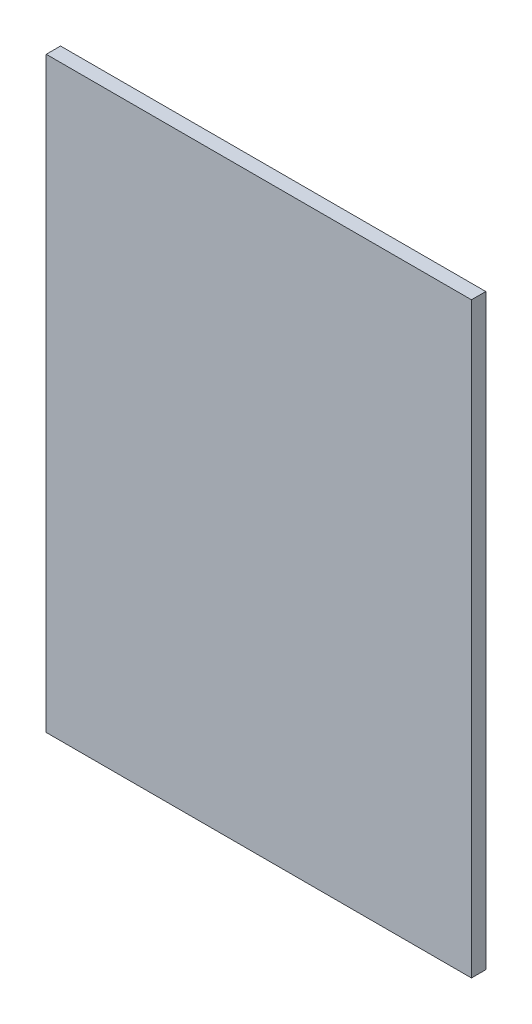
ISO-10303-21;
HEADER;
FILE_DESCRIPTION(('STEP AP214'),'2;1');
FILE_NAME('part.step','',(''),(''),'','','');
FILE_SCHEMA(('AUTOMOTIVE_DESIGN { 1 0 10303 214 1 1 1 1 }'));
ENDSEC;
DATA;
#1=APPLICATION_CONTEXT('core data for automotive mechanical design processes');
#2=APPLICATION_PROTOCOL_DEFINITION('international standard','automotive_design',2000,#1);
#3=PRODUCT_CONTEXT('',#1,'mechanical');
#4=PRODUCT('Part','Part','',(#3));
#5=PRODUCT_RELATED_PRODUCT_CATEGORY('part','',(#4));
#6=PRODUCT_DEFINITION_FORMATION('','',#4);
#7=PRODUCT_DEFINITION_CONTEXT('part definition',#1,'design');
#8=PRODUCT_DEFINITION('design','',#6,#7);
#9=PRODUCT_DEFINITION_SHAPE('','',#8);
#10=(LENGTH_UNIT() NAMED_UNIT(*) SI_UNIT(.MILLI.,.METRE.));
#11=(NAMED_UNIT(*) PLANE_ANGLE_UNIT() SI_UNIT($,.RADIAN.));
#12=(NAMED_UNIT(*) SI_UNIT($,.STERADIAN.) SOLID_ANGLE_UNIT());
#13=UNCERTAINTY_MEASURE_WITH_UNIT(LENGTH_MEASURE(1.E-05),#10,'distance_accuracy_value','');
#14=(GEOMETRIC_REPRESENTATION_CONTEXT(3) GLOBAL_UNCERTAINTY_ASSIGNED_CONTEXT((#13)) GLOBAL_UNIT_ASSIGNED_CONTEXT((#10,
#11,#12)) REPRESENTATION_CONTEXT('',''));
#15=CARTESIAN_POINT('',(0.,0.,0.));
#16=DIRECTION('',(0.,0.,1.));
#17=DIRECTION('',(1.,0.,0.));
#18=AXIS2_PLACEMENT_3D('',#15,#16,#17);
#19=CARTESIAN_POINT('',(0.,0.,-13.060981884262));
#20=DIRECTION('',(0.,0.,1.));
#21=DIRECTION('',(1.,0.,0.));
#22=AXIS2_PLACEMENT_3D('',#19,#20,#21);
#23=PLANE('',#22);
#24=DIRECTION('',(0.,1.,0.));
#25=VECTOR('',#24,1.);
#26=CARTESIAN_POINT('',(64.4250874660415,0.,-13.060981884262));
#27=LINE('',#26,#25);
#28=CARTESIAN_POINT('',(64.4250874660415,-38.8232515466776,-13.060981884262));
#29=VERTEX_POINT('',#28);
#30=CARTESIAN_POINT('',(64.4250874660415,30.1885484533224,-13.060981884262));
#31=VERTEX_POINT('',#30);
#32=EDGE_CURVE('E93',#29,#31,#27,.T.);
#33=ORIENTED_EDGE('',*,*,#32,.F.);
#34=DIRECTION('',(1.,0.,0.));
#35=VECTOR('',#34,1.);
#36=CARTESIAN_POINT('',(0.,-38.8232515466776,-13.060981884262));
#37=LINE('',#36,#35);
#38=CARTESIAN_POINT('',(14.4632874660415,-38.8232515466776,-13.060981884262));
#39=VERTEX_POINT('',#38);
#40=EDGE_CURVE('E105',#39,#29,#37,.T.);
#41=ORIENTED_EDGE('',*,*,#40,.F.);
#42=DIRECTION('',(0.,-1.,0.));
#43=VECTOR('',#42,1.);
#44=CARTESIAN_POINT('',(14.4632874660415,0.,-13.060981884262));
#45=LINE('',#44,#43);
#46=CARTESIAN_POINT('',(14.4632874660415,30.1885484533224,-13.060981884262));
#47=VERTEX_POINT('',#46);
#48=EDGE_CURVE('E91',#47,#39,#45,.T.);
#49=ORIENTED_EDGE('',*,*,#48,.F.);
#50=DIRECTION('',(-1.,0.,0.));
#51=VECTOR('',#50,1.);
#52=CARTESIAN_POINT('',(0.,30.1885484533224,-13.060981884262));
#53=LINE('',#52,#51);
#54=EDGE_CURVE('E85',#31,#47,#53,.T.);
#55=ORIENTED_EDGE('',*,*,#54,.F.);
#56=EDGE_LOOP('',(#33,#41,#49,#55));
#57=FACE_BOUND('',#56,.T.);
#58=ADVANCED_FACE('F41',(#57),#23,.F.);
#59=CARTESIAN_POINT('',(0.,-38.8232515466776,78.2198683308676));
#60=DIRECTION('',(0.,1.,0.));
#61=DIRECTION('',(-1.,0.,0.));
#62=AXIS2_PLACEMENT_3D('',#59,#60,#61);
#63=PLANE('',#62);
#64=DIRECTION('',(0.,0.,-1.));
#65=VECTOR('',#64,1.);
#66=CARTESIAN_POINT('',(64.4250874660415,-38.8232515466776,78.2198683308676));
#67=LINE('',#66,#65);
#68=CARTESIAN_POINT('',(64.4250874660415,-38.8232515466776,-11.378781884262));
#69=VERTEX_POINT('',#68);
#70=EDGE_CURVE('E96',#69,#29,#67,.T.);
#71=ORIENTED_EDGE('',*,*,#70,.F.);
#72=DIRECTION('',(-1.,0.,0.));
#73=VECTOR('',#72,1.);
#74=CARTESIAN_POINT('',(0.,-38.8232515466776,-11.378781884262));
#75=LINE('',#74,#73);
#76=CARTESIAN_POINT('',(14.4632874660415,-38.8232515466776,-11.3787818842619));
#77=VERTEX_POINT('',#76);
#78=EDGE_CURVE('E44',#69,#77,#75,.T.);
#79=ORIENTED_EDGE('',*,*,#78,.T.);
#80=DIRECTION('',(0.,0.,-1.));
#81=VECTOR('',#80,1.);
#82=CARTESIAN_POINT('',(14.4632874660415,-38.8232515466776,78.2198683308676));
#83=LINE('',#82,#81);
#84=EDGE_CURVE('E104',#77,#39,#83,.T.);
#85=ORIENTED_EDGE('',*,*,#84,.T.);
#86=ORIENTED_EDGE('',*,*,#40,.T.);
#87=EDGE_LOOP('',(#71,#79,#85,#86));
#88=FACE_BOUND('',#87,.T.);
#89=ADVANCED_FACE('F111',(#88),#63,.F.);
#90=CARTESIAN_POINT('',(14.4632874660415,0.,78.2198683308676));
#91=DIRECTION('',(1.,0.,0.));
#92=DIRECTION('',(0.,0.,-1.));
#93=AXIS2_PLACEMENT_3D('',#90,#91,#92);
#94=PLANE('',#93);
#95=ORIENTED_EDGE('',*,*,#84,.F.);
#96=DIRECTION('',(0.,1.,0.));
#97=VECTOR('',#96,1.);
#98=CARTESIAN_POINT('',(14.4632874660415,0.,-11.378781884262));
#99=LINE('',#98,#97);
#100=CARTESIAN_POINT('',(14.4632874660415,30.1885484533224,-11.378781884262));
#101=VERTEX_POINT('',#100);
#102=EDGE_CURVE('E112',#77,#101,#99,.T.);
#103=ORIENTED_EDGE('',*,*,#102,.T.);
#104=DIRECTION('',(0.,0.,-1.));
#105=VECTOR('',#104,1.);
#106=CARTESIAN_POINT('',(14.4632874660415,30.1885484533224,78.2198683308676));
#107=LINE('',#106,#105);
#108=EDGE_CURVE('E87',#101,#47,#107,.T.);
#109=ORIENTED_EDGE('',*,*,#108,.T.);
#110=ORIENTED_EDGE('',*,*,#48,.T.);
#111=EDGE_LOOP('',(#95,#103,#109,#110));
#112=FACE_BOUND('',#111,.T.);
#113=ADVANCED_FACE('F109',(#112),#94,.F.);
#114=CARTESIAN_POINT('',(0.,30.1885484533224,78.2198683308676));
#115=DIRECTION('',(0.,-1.,0.));
#116=DIRECTION('',(1.,0.,0.));
#117=AXIS2_PLACEMENT_3D('',#114,#115,#116);
#118=PLANE('',#117);
#119=ORIENTED_EDGE('',*,*,#108,.F.);
#120=DIRECTION('',(1.,0.,0.));
#121=VECTOR('',#120,1.);
#122=CARTESIAN_POINT('',(0.,30.1885484533224,-11.378781884262));
#123=LINE('',#122,#121);
#124=CARTESIAN_POINT('',(64.4250874660415,30.1885484533224,-11.378781884262));
#125=VERTEX_POINT('',#124);
#126=EDGE_CURVE('E49',#101,#125,#123,.T.);
#127=ORIENTED_EDGE('',*,*,#126,.T.);
#128=DIRECTION('',(0.,0.,-1.));
#129=VECTOR('',#128,1.);
#130=CARTESIAN_POINT('',(64.4250874660415,30.1885484533224,78.2198683308676));
#131=LINE('',#130,#129);
#132=EDGE_CURVE('E78',#125,#31,#131,.T.);
#133=ORIENTED_EDGE('',*,*,#132,.T.);
#134=ORIENTED_EDGE('',*,*,#54,.T.);
#135=EDGE_LOOP('',(#119,#127,#133,#134));
#136=FACE_BOUND('',#135,.T.);
#137=ADVANCED_FACE('F81',(#136),#118,.F.);
#138=CARTESIAN_POINT('',(64.4250874660415,0.,78.2198683308676));
#139=DIRECTION('',(-1.,0.,0.));
#140=DIRECTION('',(0.,-1.,0.));
#141=AXIS2_PLACEMENT_3D('',#138,#139,#140);
#142=PLANE('',#141);
#143=ORIENTED_EDGE('',*,*,#132,.F.);
#144=DIRECTION('',(0.,-1.,0.));
#145=VECTOR('',#144,1.);
#146=CARTESIAN_POINT('',(64.4250874660415,0.,-11.378781884262));
#147=LINE('',#146,#145);
#148=EDGE_CURVE('E11',#125,#69,#147,.T.);
#149=ORIENTED_EDGE('',*,*,#148,.T.);
#150=ORIENTED_EDGE('',*,*,#70,.T.);
#151=ORIENTED_EDGE('',*,*,#32,.T.);
#152=EDGE_LOOP('',(#143,#149,#150,#151));
#153=FACE_BOUND('',#152,.T.);
#154=ADVANCED_FACE('F43',(#153),#142,.F.);
#155=CARTESIAN_POINT('',(39.5012515364215,-2.01865154667757,-11.378781884262));
#156=DIRECTION('',(0.,0.,-1.));
#157=DIRECTION('',(0.,-1.,0.));
#158=AXIS2_PLACEMENT_3D('',#155,#156,#157);
#159=PLANE('',#158);
#160=ORIENTED_EDGE('',*,*,#126,.F.);
#161=ORIENTED_EDGE('',*,*,#102,.F.);
#162=ORIENTED_EDGE('',*,*,#78,.F.);
#163=ORIENTED_EDGE('',*,*,#148,.F.);
#164=EDGE_LOOP('',(#160,#161,#162,#163));
#165=FACE_BOUND('',#164,.T.);
#166=ADVANCED_FACE('F126',(#165),#159,.F.);
#167=CLOSED_SHELL('',(#58,#89,#113,#137,#154,#166));
#168=MANIFOLD_SOLID_BREP('B2',#167);
#169=ADVANCED_BREP_SHAPE_REPRESENTATION('',(#18,#168),#14);
#170=SHAPE_DEFINITION_REPRESENTATION(#9,#169);
ENDSEC;
END-ISO-10303-21;
